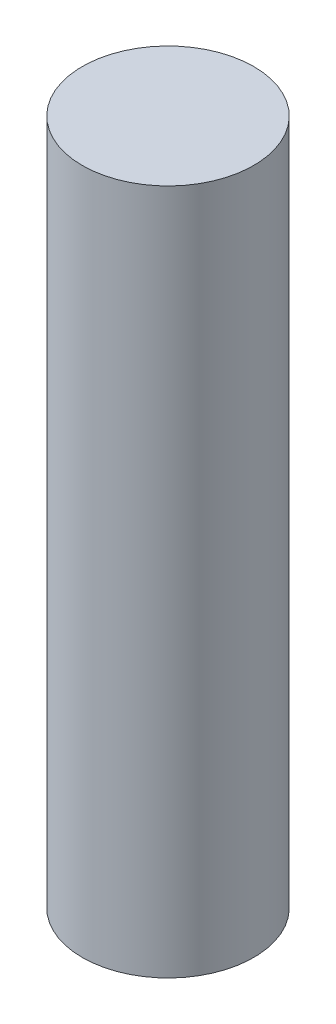
ISO-10303-21;
HEADER;
FILE_DESCRIPTION(('STEP AP214'),'2;1');
FILE_NAME('part.step','',(''),(''),'','','');
FILE_SCHEMA(('AUTOMOTIVE_DESIGN { 1 0 10303 214 1 1 1 1 }'));
ENDSEC;
DATA;
#1=APPLICATION_CONTEXT('core data for automotive mechanical design processes');
#2=APPLICATION_PROTOCOL_DEFINITION('international standard','automotive_design',2000,#1);
#3=PRODUCT_CONTEXT('',#1,'mechanical');
#4=PRODUCT('Part','Part','',(#3));
#5=PRODUCT_RELATED_PRODUCT_CATEGORY('part','',(#4));
#6=PRODUCT_DEFINITION_FORMATION('','',#4);
#7=PRODUCT_DEFINITION_CONTEXT('part definition',#1,'design');
#8=PRODUCT_DEFINITION('design','',#6,#7);
#9=PRODUCT_DEFINITION_SHAPE('','',#8);
#10=(LENGTH_UNIT() NAMED_UNIT(*) SI_UNIT(.MILLI.,.METRE.));
#11=(NAMED_UNIT(*) PLANE_ANGLE_UNIT() SI_UNIT($,.RADIAN.));
#12=(NAMED_UNIT(*) SI_UNIT($,.STERADIAN.) SOLID_ANGLE_UNIT());
#13=UNCERTAINTY_MEASURE_WITH_UNIT(LENGTH_MEASURE(1.E-05),#10,'distance_accuracy_value','');
#14=(GEOMETRIC_REPRESENTATION_CONTEXT(3) GLOBAL_UNCERTAINTY_ASSIGNED_CONTEXT((#13)) GLOBAL_UNIT_ASSIGNED_CONTEXT((#10,
#11,#12)) REPRESENTATION_CONTEXT('',''));
#15=CARTESIAN_POINT('',(0.,0.,0.));
#16=DIRECTION('',(0.,0.,1.));
#17=DIRECTION('',(1.,0.,0.));
#18=AXIS2_PLACEMENT_3D('',#15,#16,#17);
#19=CARTESIAN_POINT('',(0.,12.7,0.));
#20=DIRECTION('',(0.,-1.,0.));
#21=DIRECTION('',(0.,0.,-1.));
#22=AXIS2_PLACEMENT_3D('',#19,#20,#21);
#23=PLANE('',#22);
#24=CARTESIAN_POINT('',(0.,12.7,0.));
#25=DIRECTION('',(0.,-1.,0.));
#26=DIRECTION('',(0.,0.,-1.));
#27=AXIS2_PLACEMENT_3D('',#24,#25,#26);
#28=CIRCLE('',#27,2.0828);
#29=CARTESIAN_POINT('',(0.,12.7,-2.0828));
#30=VERTEX_POINT('',#29);
#31=EDGE_CURVE('E17',#30,#30,#28,.T.);
#32=ORIENTED_EDGE('',*,*,#31,.T.);
#33=EDGE_LOOP('',(#32));
#34=FACE_BOUND('',#33,.T.);
#35=ADVANCED_FACE('F14',(#34),#23,.T.);
#36=CARTESIAN_POINT('',(0.,0.,0.));
#37=DIRECTION('',(0.,-1.,0.));
#38=DIRECTION('',(0.,0.,-1.));
#39=AXIS2_PLACEMENT_3D('',#36,#37,#38);
#40=CYLINDRICAL_SURFACE('',#39,2.0828);
#41=ORIENTED_EDGE('',*,*,#31,.F.);
#42=EDGE_LOOP('',(#41));
#43=FACE_BOUND('',#42,.T.);
#44=CARTESIAN_POINT('',(0.,0.,0.));
#45=DIRECTION('',(0.,-1.,0.));
#46=DIRECTION('',(0.,0.,-1.));
#47=AXIS2_PLACEMENT_3D('',#44,#45,#46);
#48=CIRCLE('',#47,2.0828);
#49=CARTESIAN_POINT('',(0.,0.,-2.0828));
#50=VERTEX_POINT('',#49);
#51=EDGE_CURVE('E26',#50,#50,#48,.T.);
#52=ORIENTED_EDGE('',*,*,#51,.T.);
#53=EDGE_LOOP('',(#52));
#54=FACE_BOUND('',#53,.T.);
#55=ADVANCED_FACE('F35',(#43,#54),#40,.F.);
#56=CARTESIAN_POINT('',(0.,0.,0.));
#57=DIRECTION('',(0.,1.,0.));
#58=DIRECTION('',(0.,0.,1.));
#59=AXIS2_PLACEMENT_3D('',#56,#57,#58);
#60=PLANE('',#59);
#61=ORIENTED_EDGE('',*,*,#51,.F.);
#62=EDGE_LOOP('',(#61));
#63=FACE_BOUND('',#62,.T.);
#64=CARTESIAN_POINT('',(0.,0.,0.));
#65=DIRECTION('',(0.,1.,0.));
#66=DIRECTION('',(0.,0.,1.));
#67=AXIS2_PLACEMENT_3D('',#64,#65,#66);
#68=CIRCLE('',#67,6.35);
#69=CARTESIAN_POINT('',(0.,0.,6.35));
#70=VERTEX_POINT('',#69);
#71=EDGE_CURVE('E21',#70,#70,#68,.T.);
#72=ORIENTED_EDGE('',*,*,#71,.F.);
#73=EDGE_LOOP('',(#72));
#74=FACE_BOUND('',#73,.T.);
#75=ADVANCED_FACE('F37',(#63,#74),#60,.F.);
#76=CARTESIAN_POINT('',(0.,50.8,0.));
#77=DIRECTION('',(0.,1.,0.));
#78=DIRECTION('',(0.,0.,1.));
#79=AXIS2_PLACEMENT_3D('',#76,#77,#78);
#80=PLANE('',#79);
#81=CARTESIAN_POINT('',(0.,50.8,0.));
#82=DIRECTION('',(0.,1.,0.));
#83=DIRECTION('',(0.,0.,1.));
#84=AXIS2_PLACEMENT_3D('',#81,#82,#83);
#85=CIRCLE('',#84,6.35);
#86=CARTESIAN_POINT('',(0.,50.8,6.35));
#87=VERTEX_POINT('',#86);
#88=EDGE_CURVE('E10',#87,#87,#85,.F.);
#89=ORIENTED_EDGE('',*,*,#88,.F.);
#90=EDGE_LOOP('',(#89));
#91=FACE_BOUND('',#90,.T.);
#92=ADVANCED_FACE('F43',(#91),#80,.T.);
#93=CARTESIAN_POINT('',(0.,0.,0.));
#94=DIRECTION('',(0.,1.,0.));
#95=DIRECTION('',(0.,0.,1.));
#96=AXIS2_PLACEMENT_3D('',#93,#94,#95);
#97=CYLINDRICAL_SURFACE('',#96,6.35);
#98=ORIENTED_EDGE('',*,*,#88,.T.);
#99=EDGE_LOOP('',(#98));
#100=FACE_BOUND('',#99,.T.);
#101=ORIENTED_EDGE('',*,*,#71,.T.);
#102=EDGE_LOOP('',(#101));
#103=FACE_BOUND('',#102,.T.);
#104=ADVANCED_FACE('F46',(#100,#103),#97,.T.);
#105=CLOSED_SHELL('',(#35,#55,#75,#92,#104));
#106=MANIFOLD_SOLID_BREP('B1',#105);
#107=ADVANCED_BREP_SHAPE_REPRESENTATION('',(#18,#106),#14);
#108=SHAPE_DEFINITION_REPRESENTATION(#9,#107);
ENDSEC;
END-ISO-10303-21;
